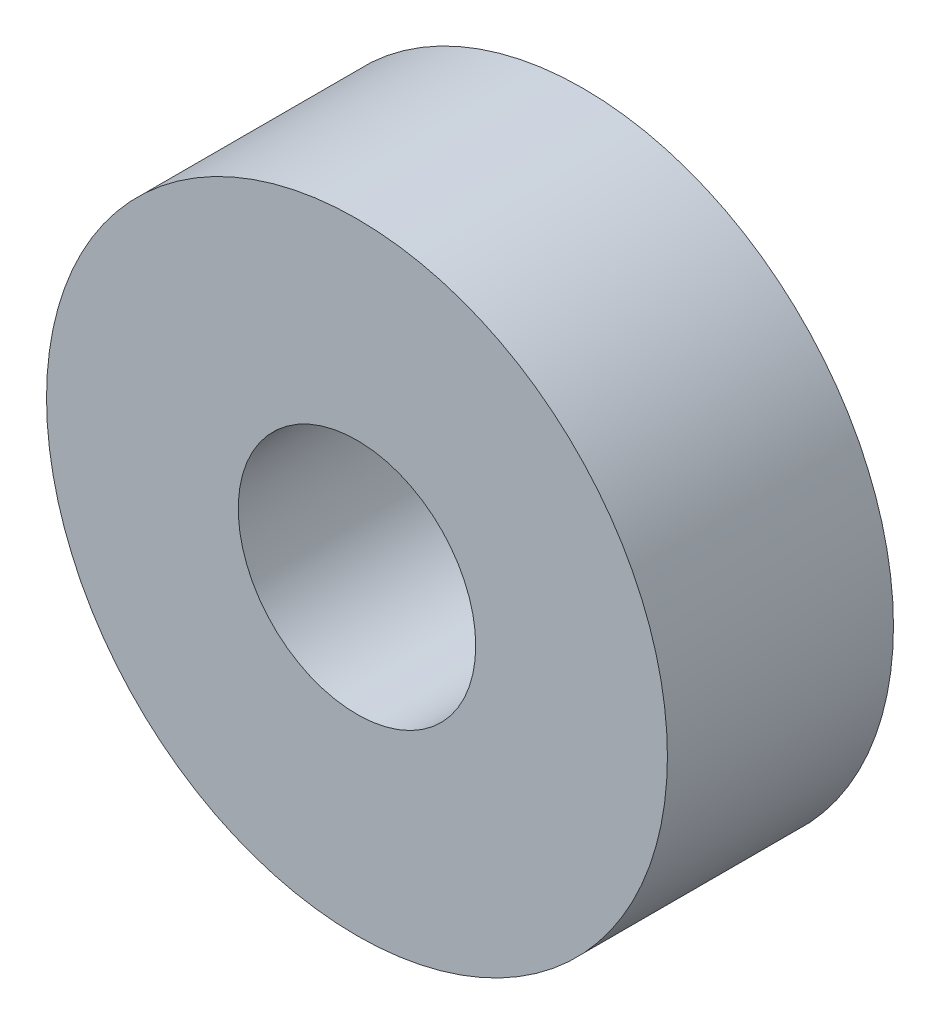
ISO-10303-21;
HEADER;
FILE_DESCRIPTION(('STEP AP214'),'2;1');
FILE_NAME('part.step','',(''),(''),'','','');
FILE_SCHEMA(('AUTOMOTIVE_DESIGN { 1 0 10303 214 1 1 1 1 }'));
ENDSEC;
DATA;
#1=APPLICATION_CONTEXT('core data for automotive mechanical design processes');
#2=APPLICATION_PROTOCOL_DEFINITION('international standard','automotive_design',2000,#1);
#3=PRODUCT_CONTEXT('',#1,'mechanical');
#4=PRODUCT('Part','Part','',(#3));
#5=PRODUCT_RELATED_PRODUCT_CATEGORY('part','',(#4));
#6=PRODUCT_DEFINITION_FORMATION('','',#4);
#7=PRODUCT_DEFINITION_CONTEXT('part definition',#1,'design');
#8=PRODUCT_DEFINITION('design','',#6,#7);
#9=PRODUCT_DEFINITION_SHAPE('','',#8);
#10=(LENGTH_UNIT() NAMED_UNIT(*) SI_UNIT(.MILLI.,.METRE.));
#11=(NAMED_UNIT(*) PLANE_ANGLE_UNIT() SI_UNIT($,.RADIAN.));
#12=(NAMED_UNIT(*) SI_UNIT($,.STERADIAN.) SOLID_ANGLE_UNIT());
#13=UNCERTAINTY_MEASURE_WITH_UNIT(LENGTH_MEASURE(1.E-05),#10,'distance_accuracy_value','');
#14=(GEOMETRIC_REPRESENTATION_CONTEXT(3) GLOBAL_UNCERTAINTY_ASSIGNED_CONTEXT((#13)) GLOBAL_UNIT_ASSIGNED_CONTEXT((#10,
#11,#12)) REPRESENTATION_CONTEXT('',''));
#15=CARTESIAN_POINT('',(0.,0.,0.));
#16=DIRECTION('',(0.,0.,1.));
#17=DIRECTION('',(1.,0.,0.));
#18=AXIS2_PLACEMENT_3D('',#15,#16,#17);
#19=CARTESIAN_POINT('',(0.,0.,7.9));
#20=DIRECTION('',(0.,0.,1.));
#21=DIRECTION('',(1.,0.,0.));
#22=AXIS2_PLACEMENT_3D('',#19,#20,#21);
#23=PLANE('',#22);
#24=CARTESIAN_POINT('',(0.,0.,7.9));
#25=DIRECTION('',(0.,0.,1.));
#26=DIRECTION('',(1.,0.,0.));
#27=AXIS2_PLACEMENT_3D('',#24,#25,#26);
#28=CIRCLE('',#27,10.85);
#29=CARTESIAN_POINT('',(10.85,0.,7.9));
#30=VERTEX_POINT('',#29);
#31=EDGE_CURVE('E10',#30,#30,#28,.T.);
#32=ORIENTED_EDGE('',*,*,#31,.T.);
#33=EDGE_LOOP('',(#32));
#34=FACE_BOUND('',#33,.T.);
#35=CARTESIAN_POINT('',(0.,0.,7.9));
#36=DIRECTION('',(0.,0.,1.));
#37=DIRECTION('',(1.,0.,0.));
#38=AXIS2_PLACEMENT_3D('',#35,#36,#37);
#39=CIRCLE('',#38,4.15);
#40=CARTESIAN_POINT('',(4.15,0.,7.9));
#41=VERTEX_POINT('',#40);
#42=EDGE_CURVE('E42',#41,#41,#39,.T.);
#43=ORIENTED_EDGE('',*,*,#42,.F.);
#44=EDGE_LOOP('',(#43));
#45=FACE_BOUND('',#44,.T.);
#46=ADVANCED_FACE('F31',(#34,#45),#23,.T.);
#47=CARTESIAN_POINT('',(0.,0.,0.));
#48=DIRECTION('',(0.,0.,1.));
#49=DIRECTION('',(1.,0.,0.));
#50=AXIS2_PLACEMENT_3D('',#47,#48,#49);
#51=PLANE('',#50);
#52=CARTESIAN_POINT('',(0.,0.,0.));
#53=DIRECTION('',(0.,0.,1.));
#54=DIRECTION('',(1.,0.,0.));
#55=AXIS2_PLACEMENT_3D('',#52,#53,#54);
#56=CIRCLE('',#55,10.85);
#57=CARTESIAN_POINT('',(10.85,0.,0.));
#58=VERTEX_POINT('',#57);
#59=EDGE_CURVE('E35',#58,#58,#56,.T.);
#60=ORIENTED_EDGE('',*,*,#59,.F.);
#61=EDGE_LOOP('',(#60));
#62=FACE_BOUND('',#61,.T.);
#63=CARTESIAN_POINT('',(0.,0.,0.));
#64=DIRECTION('',(0.,0.,1.));
#65=DIRECTION('',(1.,0.,0.));
#66=AXIS2_PLACEMENT_3D('',#63,#64,#65);
#67=CIRCLE('',#66,4.15);
#68=CARTESIAN_POINT('',(4.15,0.,0.));
#69=VERTEX_POINT('',#68);
#70=EDGE_CURVE('E44',#69,#69,#67,.T.);
#71=ORIENTED_EDGE('',*,*,#70,.T.);
#72=EDGE_LOOP('',(#71));
#73=FACE_BOUND('',#72,.T.);
#74=ADVANCED_FACE('F54',(#62,#73),#51,.F.);
#75=CARTESIAN_POINT('',(0.,0.,7.9));
#76=DIRECTION('',(0.,0.,-1.));
#77=DIRECTION('',(-1.,0.,0.));
#78=AXIS2_PLACEMENT_3D('',#75,#76,#77);
#79=CYLINDRICAL_SURFACE('',#78,10.85);
#80=ORIENTED_EDGE('',*,*,#31,.F.);
#81=EDGE_LOOP('',(#80));
#82=FACE_BOUND('',#81,.T.);
#83=ORIENTED_EDGE('',*,*,#59,.T.);
#84=EDGE_LOOP('',(#83));
#85=FACE_BOUND('',#84,.T.);
#86=ADVANCED_FACE('F33',(#82,#85),#79,.T.);
#87=CARTESIAN_POINT('',(0.,0.,7.9));
#88=DIRECTION('',(0.,0.,-1.));
#89=DIRECTION('',(-1.,0.,0.));
#90=AXIS2_PLACEMENT_3D('',#87,#88,#89);
#91=CYLINDRICAL_SURFACE('',#90,4.15);
#92=ORIENTED_EDGE('',*,*,#42,.T.);
#93=EDGE_LOOP('',(#92));
#94=FACE_BOUND('',#93,.T.);
#95=ORIENTED_EDGE('',*,*,#70,.F.);
#96=EDGE_LOOP('',(#95));
#97=FACE_BOUND('',#96,.T.);
#98=ADVANCED_FACE('F50',(#94,#97),#91,.F.);
#99=CLOSED_SHELL('',(#46,#74,#86,#98));
#100=MANIFOLD_SOLID_BREP('B2',#99);
#101=ADVANCED_BREP_SHAPE_REPRESENTATION('',(#18,#100),#14);
#102=SHAPE_DEFINITION_REPRESENTATION(#9,#101);
ENDSEC;
END-ISO-10303-21;
